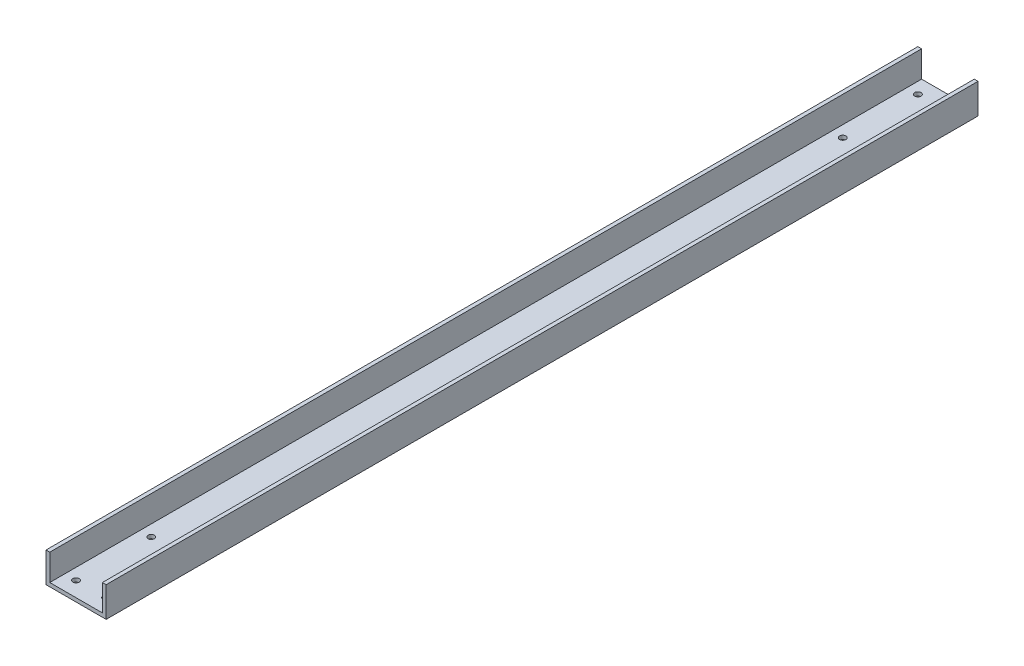
ISO-10303-21;
HEADER;
FILE_DESCRIPTION(('STEP AP214'),'2;1');
FILE_NAME('part.step','',(''),(''),'','','');
FILE_SCHEMA(('AUTOMOTIVE_DESIGN { 1 0 10303 214 1 1 1 1 }'));
ENDSEC;
DATA;
#1=APPLICATION_CONTEXT('core data for automotive mechanical design processes');
#2=APPLICATION_PROTOCOL_DEFINITION('international standard','automotive_design',2000,#1);
#3=PRODUCT_CONTEXT('',#1,'mechanical');
#4=PRODUCT('Part','Part','',(#3));
#5=PRODUCT_RELATED_PRODUCT_CATEGORY('part','',(#4));
#6=PRODUCT_DEFINITION_FORMATION('','',#4);
#7=PRODUCT_DEFINITION_CONTEXT('part definition',#1,'design');
#8=PRODUCT_DEFINITION('design','',#6,#7);
#9=PRODUCT_DEFINITION_SHAPE('','',#8);
#10=(LENGTH_UNIT() NAMED_UNIT(*) SI_UNIT(.MILLI.,.METRE.));
#11=(NAMED_UNIT(*) PLANE_ANGLE_UNIT() SI_UNIT($,.RADIAN.));
#12=(NAMED_UNIT(*) SI_UNIT($,.STERADIAN.) SOLID_ANGLE_UNIT());
#13=UNCERTAINTY_MEASURE_WITH_UNIT(LENGTH_MEASURE(1.E-05),#10,'distance_accuracy_value','');
#14=(GEOMETRIC_REPRESENTATION_CONTEXT(3) GLOBAL_UNCERTAINTY_ASSIGNED_CONTEXT((#13)) GLOBAL_UNIT_ASSIGNED_CONTEXT((#10,
#11,#12)) REPRESENTATION_CONTEXT('',''));
#15=CARTESIAN_POINT('',(0.,0.,0.));
#16=DIRECTION('',(0.,0.,1.));
#17=DIRECTION('',(1.,0.,0.));
#18=AXIS2_PLACEMENT_3D('',#15,#16,#17);
#19=CARTESIAN_POINT('',(0.,0.,736.6));
#20=DIRECTION('',(1.,0.,0.));
#21=DIRECTION('',(0.,0.,-1.));
#22=AXIS2_PLACEMENT_3D('',#19,#20,#21);
#23=PLANE('',#22);
#24=DIRECTION('',(0.,-1.,0.));
#25=VECTOR('',#24,1.);
#26=CARTESIAN_POINT('',(0.,0.,0.));
#27=LINE('',#26,#25);
#28=CARTESIAN_POINT('',(0.,25.4,0.));
#29=VERTEX_POINT('',#28);
#30=CARTESIAN_POINT('',(0.,0.,0.));
#31=VERTEX_POINT('',#30);
#32=EDGE_CURVE('E134',#29,#31,#27,.T.);
#33=ORIENTED_EDGE('',*,*,#32,.T.);
#34=DIRECTION('',(0.,0.,-1.));
#35=VECTOR('',#34,1.);
#36=CARTESIAN_POINT('',(0.,0.,736.6));
#37=LINE('',#36,#35);
#38=CARTESIAN_POINT('',(0.,0.,736.6));
#39=VERTEX_POINT('',#38);
#40=EDGE_CURVE('E11',#39,#31,#37,.T.);
#41=ORIENTED_EDGE('',*,*,#40,.F.);
#42=DIRECTION('',(0.,-1.,0.));
#43=VECTOR('',#42,1.);
#44=CARTESIAN_POINT('',(0.,0.,736.6));
#45=LINE('',#44,#43);
#46=CARTESIAN_POINT('',(0.,25.4,736.6));
#47=VERTEX_POINT('',#46);
#48=EDGE_CURVE('E149',#47,#39,#45,.T.);
#49=ORIENTED_EDGE('',*,*,#48,.F.);
#50=DIRECTION('',(0.,0.,-1.));
#51=VECTOR('',#50,1.);
#52=CARTESIAN_POINT('',(0.,25.4,736.6));
#53=LINE('',#52,#51);
#54=EDGE_CURVE('E130',#47,#29,#53,.T.);
#55=ORIENTED_EDGE('',*,*,#54,.T.);
#56=EDGE_LOOP('',(#33,#41,#49,#55));
#57=FACE_BOUND('',#56,.T.);
#58=ADVANCED_FACE('F36',(#57),#23,.F.);
#59=CARTESIAN_POINT('',(0.,0.,736.6));
#60=DIRECTION('',(0.,1.,0.));
#61=DIRECTION('',(0.,0.,1.));
#62=AXIS2_PLACEMENT_3D('',#59,#60,#61);
#63=PLANE('',#62);
#64=CARTESIAN_POINT('',(12.7,0.,660.4));
#65=DIRECTION('',(0.,1.,0.));
#66=DIRECTION('',(0.,0.,1.));
#67=AXIS2_PLACEMENT_3D('',#64,#65,#66);
#68=CIRCLE('',#67,2.667);
#69=CARTESIAN_POINT('',(12.7,0.,663.067));
#70=VERTEX_POINT('',#69);
#71=EDGE_CURVE('E193',#70,#70,#68,.F.);
#72=ORIENTED_EDGE('',*,*,#71,.F.);
#73=EDGE_LOOP('',(#72));
#74=FACE_BOUND('',#73,.T.);
#75=CARTESIAN_POINT('',(38.1,0.,660.4));
#76=DIRECTION('',(0.,1.,0.));
#77=DIRECTION('',(0.,0.,1.));
#78=AXIS2_PLACEMENT_3D('',#75,#76,#77);
#79=CIRCLE('',#78,2.667);
#80=CARTESIAN_POINT('',(38.1,0.,663.067));
#81=VERTEX_POINT('',#80);
#82=EDGE_CURVE('E225',#81,#81,#79,.F.);
#83=ORIENTED_EDGE('',*,*,#82,.F.);
#84=EDGE_LOOP('',(#83));
#85=FACE_BOUND('',#84,.T.);
#86=CARTESIAN_POINT('',(38.1,0.,723.9));
#87=DIRECTION('',(0.,1.,0.));
#88=DIRECTION('',(0.,0.,1.));
#89=AXIS2_PLACEMENT_3D('',#86,#87,#88);
#90=CIRCLE('',#89,2.667);
#91=CARTESIAN_POINT('',(38.1,0.,726.567));
#92=VERTEX_POINT('',#91);
#93=EDGE_CURVE('E219',#92,#92,#90,.F.);
#94=ORIENTED_EDGE('',*,*,#93,.F.);
#95=EDGE_LOOP('',(#94));
#96=FACE_BOUND('',#95,.T.);
#97=CARTESIAN_POINT('',(38.1,0.,12.7));
#98=DIRECTION('',(0.,1.,0.));
#99=DIRECTION('',(0.,0.,1.));
#100=AXIS2_PLACEMENT_3D('',#97,#98,#99);
#101=CIRCLE('',#100,2.667);
#102=CARTESIAN_POINT('',(38.1,0.,15.367));
#103=VERTEX_POINT('',#102);
#104=EDGE_CURVE('E213',#103,#103,#101,.F.);
#105=ORIENTED_EDGE('',*,*,#104,.F.);
#106=EDGE_LOOP('',(#105));
#107=FACE_BOUND('',#106,.T.);
#108=CARTESIAN_POINT('',(38.1,0.,76.2));
#109=DIRECTION('',(0.,1.,0.));
#110=DIRECTION('',(0.,0.,1.));
#111=AXIS2_PLACEMENT_3D('',#108,#109,#110);
#112=CIRCLE('',#111,2.667);
#113=CARTESIAN_POINT('',(38.1,0.,78.867));
#114=VERTEX_POINT('',#113);
#115=EDGE_CURVE('E207',#114,#114,#112,.F.);
#116=ORIENTED_EDGE('',*,*,#115,.F.);
#117=EDGE_LOOP('',(#116));
#118=FACE_BOUND('',#117,.T.);
#119=CARTESIAN_POINT('',(12.7,0.,12.7));
#120=DIRECTION('',(0.,1.,0.));
#121=DIRECTION('',(0.,0.,1.));
#122=AXIS2_PLACEMENT_3D('',#119,#120,#121);
#123=CIRCLE('',#122,2.667);
#124=CARTESIAN_POINT('',(12.7,0.,15.367));
#125=VERTEX_POINT('',#124);
#126=EDGE_CURVE('E201',#125,#125,#123,.F.);
#127=ORIENTED_EDGE('',*,*,#126,.F.);
#128=EDGE_LOOP('',(#127));
#129=FACE_BOUND('',#128,.T.);
#130=CARTESIAN_POINT('',(12.7,0.,76.2));
#131=DIRECTION('',(0.,1.,0.));
#132=DIRECTION('',(0.,0.,1.));
#133=AXIS2_PLACEMENT_3D('',#130,#131,#132);
#134=CIRCLE('',#133,2.667);
#135=CARTESIAN_POINT('',(12.7,0.,78.867));
#136=VERTEX_POINT('',#135);
#137=EDGE_CURVE('E194',#136,#136,#134,.F.);
#138=ORIENTED_EDGE('',*,*,#137,.F.);
#139=EDGE_LOOP('',(#138));
#140=FACE_BOUND('',#139,.T.);
#141=CARTESIAN_POINT('',(12.7,0.,723.9));
#142=DIRECTION('',(0.,1.,0.));
#143=DIRECTION('',(0.,0.,1.));
#144=AXIS2_PLACEMENT_3D('',#141,#142,#143);
#145=CIRCLE('',#144,2.667);
#146=CARTESIAN_POINT('',(12.7,0.,726.567));
#147=VERTEX_POINT('',#146);
#148=EDGE_CURVE('E138',#147,#147,#145,.F.);
#149=ORIENTED_EDGE('',*,*,#148,.F.);
#150=EDGE_LOOP('',(#149));
#151=FACE_BOUND('',#150,.T.);
#152=DIRECTION('',(1.,0.,0.));
#153=VECTOR('',#152,1.);
#154=CARTESIAN_POINT('',(0.,0.,0.));
#155=LINE('',#154,#153);
#156=CARTESIAN_POINT('',(50.8,0.,0.));
#157=VERTEX_POINT('',#156);
#158=EDGE_CURVE('E137',#31,#157,#155,.T.);
#159=ORIENTED_EDGE('',*,*,#158,.T.);
#160=DIRECTION('',(0.,0.,-1.));
#161=VECTOR('',#160,1.);
#162=CARTESIAN_POINT('',(50.8,0.,736.6));
#163=LINE('',#162,#161);
#164=CARTESIAN_POINT('',(50.8,0.,736.6));
#165=VERTEX_POINT('',#164);
#166=EDGE_CURVE('E45',#165,#157,#163,.T.);
#167=ORIENTED_EDGE('',*,*,#166,.F.);
#168=DIRECTION('',(1.,0.,0.));
#169=VECTOR('',#168,1.);
#170=CARTESIAN_POINT('',(0.,0.,736.6));
#171=LINE('',#170,#169);
#172=EDGE_CURVE('E96',#39,#165,#171,.T.);
#173=ORIENTED_EDGE('',*,*,#172,.F.);
#174=ORIENTED_EDGE('',*,*,#40,.T.);
#175=EDGE_LOOP('',(#159,#167,#173,#174));
#176=FACE_BOUND('',#175,.T.);
#177=ADVANCED_FACE('F263',(#74,#85,#96,#107,#118,#129,#140,#151,#176),#63,.F.);
#178=CARTESIAN_POINT('',(50.8,0.,736.6));
#179=DIRECTION('',(-1.,0.,0.));
#180=DIRECTION('',(0.,0.,1.));
#181=AXIS2_PLACEMENT_3D('',#178,#179,#180);
#182=PLANE('',#181);
#183=DIRECTION('',(0.,1.,0.));
#184=VECTOR('',#183,1.);
#185=CARTESIAN_POINT('',(50.8,0.,0.));
#186=LINE('',#185,#184);
#187=CARTESIAN_POINT('',(50.8,25.4,0.));
#188=VERTEX_POINT('',#187);
#189=EDGE_CURVE('E140',#157,#188,#186,.T.);
#190=ORIENTED_EDGE('',*,*,#189,.T.);
#191=DIRECTION('',(0.,0.,-1.));
#192=VECTOR('',#191,1.);
#193=CARTESIAN_POINT('',(50.8,25.4,736.6));
#194=LINE('',#193,#192);
#195=CARTESIAN_POINT('',(50.8,25.4,736.6));
#196=VERTEX_POINT('',#195);
#197=EDGE_CURVE('E160',#196,#188,#194,.T.);
#198=ORIENTED_EDGE('',*,*,#197,.F.);
#199=DIRECTION('',(0.,1.,0.));
#200=VECTOR('',#199,1.);
#201=CARTESIAN_POINT('',(50.8,0.,736.6));
#202=LINE('',#201,#200);
#203=EDGE_CURVE('E170',#165,#196,#202,.T.);
#204=ORIENTED_EDGE('',*,*,#203,.F.);
#205=ORIENTED_EDGE('',*,*,#166,.T.);
#206=EDGE_LOOP('',(#190,#198,#204,#205));
#207=FACE_BOUND('',#206,.T.);
#208=ADVANCED_FACE('F168',(#207),#182,.F.);
#209=CARTESIAN_POINT('',(47.625,25.4,736.6));
#210=DIRECTION('',(0.,-1.,0.));
#211=DIRECTION('',(0.,0.,-1.));
#212=AXIS2_PLACEMENT_3D('',#209,#210,#211);
#213=PLANE('',#212);
#214=DIRECTION('',(-1.,0.,0.));
#215=VECTOR('',#214,1.);
#216=CARTESIAN_POINT('',(47.625,25.4,0.));
#217=LINE('',#216,#215);
#218=CARTESIAN_POINT('',(47.625,25.4,0.));
#219=VERTEX_POINT('',#218);
#220=EDGE_CURVE('E142',#188,#219,#217,.T.);
#221=ORIENTED_EDGE('',*,*,#220,.T.);
#222=DIRECTION('',(0.,0.,-1.));
#223=VECTOR('',#222,1.);
#224=CARTESIAN_POINT('',(47.625,25.4,736.6));
#225=LINE('',#224,#223);
#226=CARTESIAN_POINT('',(47.625,25.4,736.6));
#227=VERTEX_POINT('',#226);
#228=EDGE_CURVE('E156',#227,#219,#225,.T.);
#229=ORIENTED_EDGE('',*,*,#228,.F.);
#230=DIRECTION('',(-1.,0.,0.));
#231=VECTOR('',#230,1.);
#232=CARTESIAN_POINT('',(47.625,25.4,736.6));
#233=LINE('',#232,#231);
#234=EDGE_CURVE('E182',#196,#227,#233,.T.);
#235=ORIENTED_EDGE('',*,*,#234,.F.);
#236=ORIENTED_EDGE('',*,*,#197,.T.);
#237=EDGE_LOOP('',(#221,#229,#235,#236));
#238=FACE_BOUND('',#237,.T.);
#239=ADVANCED_FACE('F178',(#238),#213,.F.);
#240=CARTESIAN_POINT('',(47.625,3.175,736.6));
#241=DIRECTION('',(1.,0.,0.));
#242=DIRECTION('',(0.,0.,-1.));
#243=AXIS2_PLACEMENT_3D('',#240,#241,#242);
#244=PLANE('',#243);
#245=DIRECTION('',(0.,-1.,0.));
#246=VECTOR('',#245,1.);
#247=CARTESIAN_POINT('',(47.625,3.175,0.));
#248=LINE('',#247,#246);
#249=CARTESIAN_POINT('',(47.625,3.175,0.));
#250=VERTEX_POINT('',#249);
#251=EDGE_CURVE('E144',#219,#250,#248,.T.);
#252=ORIENTED_EDGE('',*,*,#251,.T.);
#253=DIRECTION('',(0.,0.,-1.));
#254=VECTOR('',#253,1.);
#255=CARTESIAN_POINT('',(47.625,3.175,736.6));
#256=LINE('',#255,#254);
#257=CARTESIAN_POINT('',(47.625,3.175,736.6));
#258=VERTEX_POINT('',#257);
#259=EDGE_CURVE('E125',#258,#250,#256,.T.);
#260=ORIENTED_EDGE('',*,*,#259,.F.);
#261=DIRECTION('',(0.,-1.,0.));
#262=VECTOR('',#261,1.);
#263=CARTESIAN_POINT('',(47.625,3.175,736.6));
#264=LINE('',#263,#262);
#265=EDGE_CURVE('E115',#227,#258,#264,.T.);
#266=ORIENTED_EDGE('',*,*,#265,.F.);
#267=ORIENTED_EDGE('',*,*,#228,.T.);
#268=EDGE_LOOP('',(#252,#260,#266,#267));
#269=FACE_BOUND('',#268,.T.);
#270=ADVANCED_FACE('F181',(#269),#244,.F.);
#271=CARTESIAN_POINT('',(3.175,3.175,736.6));
#272=DIRECTION('',(0.,-1.,0.));
#273=DIRECTION('',(0.,0.,-1.));
#274=AXIS2_PLACEMENT_3D('',#271,#272,#273);
#275=PLANE('',#274);
#276=CARTESIAN_POINT('',(12.7,3.175,660.4));
#277=DIRECTION('',(0.,1.,0.));
#278=DIRECTION('',(0.,0.,1.));
#279=AXIS2_PLACEMENT_3D('',#276,#277,#278);
#280=CIRCLE('',#279,2.667);
#281=CARTESIAN_POINT('',(12.7,3.175,663.067));
#282=VERTEX_POINT('',#281);
#283=EDGE_CURVE('E228',#282,#282,#280,.T.);
#284=ORIENTED_EDGE('',*,*,#283,.F.);
#285=EDGE_LOOP('',(#284));
#286=FACE_BOUND('',#285,.T.);
#287=CARTESIAN_POINT('',(38.1,3.175,660.4));
#288=DIRECTION('',(0.,1.,0.));
#289=DIRECTION('',(0.,0.,1.));
#290=AXIS2_PLACEMENT_3D('',#287,#288,#289);
#291=CIRCLE('',#290,2.667);
#292=CARTESIAN_POINT('',(38.1,3.175,663.067));
#293=VERTEX_POINT('',#292);
#294=EDGE_CURVE('E222',#293,#293,#291,.T.);
#295=ORIENTED_EDGE('',*,*,#294,.F.);
#296=EDGE_LOOP('',(#295));
#297=FACE_BOUND('',#296,.T.);
#298=CARTESIAN_POINT('',(38.1,3.175,723.9));
#299=DIRECTION('',(0.,1.,0.));
#300=DIRECTION('',(0.,0.,1.));
#301=AXIS2_PLACEMENT_3D('',#298,#299,#300);
#302=CIRCLE('',#301,2.667);
#303=CARTESIAN_POINT('',(38.1,3.175,726.567));
#304=VERTEX_POINT('',#303);
#305=EDGE_CURVE('E216',#304,#304,#302,.T.);
#306=ORIENTED_EDGE('',*,*,#305,.F.);
#307=EDGE_LOOP('',(#306));
#308=FACE_BOUND('',#307,.T.);
#309=CARTESIAN_POINT('',(38.1,3.175,12.7));
#310=DIRECTION('',(0.,1.,0.));
#311=DIRECTION('',(0.,0.,-1.));
#312=AXIS2_PLACEMENT_3D('',#309,#310,#311);
#313=CIRCLE('',#312,2.667);
#314=CARTESIAN_POINT('',(38.1,3.175,10.033));
#315=VERTEX_POINT('',#314);
#316=EDGE_CURVE('E210',#315,#315,#313,.T.);
#317=ORIENTED_EDGE('',*,*,#316,.F.);
#318=EDGE_LOOP('',(#317));
#319=FACE_BOUND('',#318,.T.);
#320=CARTESIAN_POINT('',(38.1,3.175,76.2));
#321=DIRECTION('',(0.,1.,0.));
#322=DIRECTION('',(0.,0.,-1.));
#323=AXIS2_PLACEMENT_3D('',#320,#321,#322);
#324=CIRCLE('',#323,2.667);
#325=CARTESIAN_POINT('',(38.1,3.175,73.533));
#326=VERTEX_POINT('',#325);
#327=EDGE_CURVE('E204',#326,#326,#324,.T.);
#328=ORIENTED_EDGE('',*,*,#327,.F.);
#329=EDGE_LOOP('',(#328));
#330=FACE_BOUND('',#329,.T.);
#331=CARTESIAN_POINT('',(12.7,3.175,12.7));
#332=DIRECTION('',(0.,1.,0.));
#333=DIRECTION('',(0.,0.,-1.));
#334=AXIS2_PLACEMENT_3D('',#331,#332,#333);
#335=CIRCLE('',#334,2.667);
#336=CARTESIAN_POINT('',(12.7,3.175,10.033));
#337=VERTEX_POINT('',#336);
#338=EDGE_CURVE('E197',#337,#337,#335,.T.);
#339=ORIENTED_EDGE('',*,*,#338,.F.);
#340=EDGE_LOOP('',(#339));
#341=FACE_BOUND('',#340,.T.);
#342=CARTESIAN_POINT('',(12.7,3.175,76.2));
#343=DIRECTION('',(0.,1.,0.));
#344=DIRECTION('',(0.,0.,-1.));
#345=AXIS2_PLACEMENT_3D('',#342,#343,#344);
#346=CIRCLE('',#345,2.667);
#347=CARTESIAN_POINT('',(12.7,3.175,73.533));
#348=VERTEX_POINT('',#347);
#349=EDGE_CURVE('E198',#348,#348,#346,.T.);
#350=ORIENTED_EDGE('',*,*,#349,.F.);
#351=EDGE_LOOP('',(#350));
#352=FACE_BOUND('',#351,.T.);
#353=CARTESIAN_POINT('',(12.7,3.175,723.9));
#354=DIRECTION('',(0.,1.,0.));
#355=DIRECTION('',(0.,0.,1.));
#356=AXIS2_PLACEMENT_3D('',#353,#354,#355);
#357=CIRCLE('',#356,2.667);
#358=CARTESIAN_POINT('',(12.7,3.175,726.567));
#359=VERTEX_POINT('',#358);
#360=EDGE_CURVE('E190',#359,#359,#357,.T.);
#361=ORIENTED_EDGE('',*,*,#360,.F.);
#362=EDGE_LOOP('',(#361));
#363=FACE_BOUND('',#362,.T.);
#364=DIRECTION('',(-1.,0.,0.));
#365=VECTOR('',#364,1.);
#366=CARTESIAN_POINT('',(3.175,3.175,0.));
#367=LINE('',#366,#365);
#368=CARTESIAN_POINT('',(3.175,3.175,0.));
#369=VERTEX_POINT('',#368);
#370=EDGE_CURVE('E123',#250,#369,#367,.T.);
#371=ORIENTED_EDGE('',*,*,#370,.T.);
#372=DIRECTION('',(0.,0.,-1.));
#373=VECTOR('',#372,1.);
#374=CARTESIAN_POINT('',(3.175,3.175,736.6));
#375=LINE('',#374,#373);
#376=CARTESIAN_POINT('',(3.175,3.175,736.6));
#377=VERTEX_POINT('',#376);
#378=EDGE_CURVE('E120',#377,#369,#375,.T.);
#379=ORIENTED_EDGE('',*,*,#378,.F.);
#380=DIRECTION('',(-1.,0.,0.));
#381=VECTOR('',#380,1.);
#382=CARTESIAN_POINT('',(3.175,3.175,736.6));
#383=LINE('',#382,#381);
#384=EDGE_CURVE('E109',#258,#377,#383,.T.);
#385=ORIENTED_EDGE('',*,*,#384,.F.);
#386=ORIENTED_EDGE('',*,*,#259,.T.);
#387=EDGE_LOOP('',(#371,#379,#385,#386));
#388=FACE_BOUND('',#387,.T.);
#389=ADVANCED_FACE('F121',(#286,#297,#308,#319,#330,#341,#352,#363,#388),#275,.F.);
#390=CARTESIAN_POINT('',(3.175,3.175,736.6));
#391=DIRECTION('',(-1.,0.,0.));
#392=DIRECTION('',(0.,0.,1.));
#393=AXIS2_PLACEMENT_3D('',#390,#391,#392);
#394=PLANE('',#393);
#395=DIRECTION('',(0.,1.,0.));
#396=VECTOR('',#395,1.);
#397=CARTESIAN_POINT('',(3.175,3.175,0.));
#398=LINE('',#397,#396);
#399=CARTESIAN_POINT('',(3.175,25.4,0.));
#400=VERTEX_POINT('',#399);
#401=EDGE_CURVE('E82',#369,#400,#398,.T.);
#402=ORIENTED_EDGE('',*,*,#401,.T.);
#403=DIRECTION('',(0.,0.,-1.));
#404=VECTOR('',#403,1.);
#405=CARTESIAN_POINT('',(3.175,25.4,736.6));
#406=LINE('',#405,#404);
#407=CARTESIAN_POINT('',(3.175,25.4,736.6));
#408=VERTEX_POINT('',#407);
#409=EDGE_CURVE('E126',#408,#400,#406,.T.);
#410=ORIENTED_EDGE('',*,*,#409,.F.);
#411=DIRECTION('',(0.,1.,0.));
#412=VECTOR('',#411,1.);
#413=CARTESIAN_POINT('',(3.175,3.175,736.6));
#414=LINE('',#413,#412);
#415=EDGE_CURVE('E113',#377,#408,#414,.T.);
#416=ORIENTED_EDGE('',*,*,#415,.F.);
#417=ORIENTED_EDGE('',*,*,#378,.T.);
#418=EDGE_LOOP('',(#402,#410,#416,#417));
#419=FACE_BOUND('',#418,.T.);
#420=ADVANCED_FACE('F128',(#419),#394,.F.);
#421=CARTESIAN_POINT('',(0.,25.4,736.6));
#422=DIRECTION('',(0.,-1.,0.));
#423=DIRECTION('',(0.,0.,-1.));
#424=AXIS2_PLACEMENT_3D('',#421,#422,#423);
#425=PLANE('',#424);
#426=DIRECTION('',(-1.,0.,0.));
#427=VECTOR('',#426,1.);
#428=CARTESIAN_POINT('',(0.,25.4,0.));
#429=LINE('',#428,#427);
#430=EDGE_CURVE('E88',#400,#29,#429,.T.);
#431=ORIENTED_EDGE('',*,*,#430,.T.);
#432=ORIENTED_EDGE('',*,*,#54,.F.);
#433=DIRECTION('',(-1.,0.,0.));
#434=VECTOR('',#433,1.);
#435=CARTESIAN_POINT('',(0.,25.4,736.6));
#436=LINE('',#435,#434);
#437=EDGE_CURVE('E53',#408,#47,#436,.T.);
#438=ORIENTED_EDGE('',*,*,#437,.F.);
#439=ORIENTED_EDGE('',*,*,#409,.T.);
#440=EDGE_LOOP('',(#431,#432,#438,#439));
#441=FACE_BOUND('',#440,.T.);
#442=ADVANCED_FACE('F269',(#441),#425,.F.);
#443=CARTESIAN_POINT('',(0.,0.,736.6));
#444=DIRECTION('',(0.,0.,-1.));
#445=DIRECTION('',(-1.,0.,0.));
#446=AXIS2_PLACEMENT_3D('',#443,#444,#445);
#447=PLANE('',#446);
#448=ORIENTED_EDGE('',*,*,#48,.T.);
#449=ORIENTED_EDGE('',*,*,#172,.T.);
#450=ORIENTED_EDGE('',*,*,#203,.T.);
#451=ORIENTED_EDGE('',*,*,#234,.T.);
#452=ORIENTED_EDGE('',*,*,#265,.T.);
#453=ORIENTED_EDGE('',*,*,#384,.T.);
#454=ORIENTED_EDGE('',*,*,#415,.T.);
#455=ORIENTED_EDGE('',*,*,#437,.T.);
#456=EDGE_LOOP('',(#448,#449,#450,#451,#452,#453,#454,#455));
#457=FACE_BOUND('',#456,.T.);
#458=ADVANCED_FACE('F111',(#457),#447,.F.);
#459=CARTESIAN_POINT('',(0.,0.,0.));
#460=DIRECTION('',(0.,0.,-1.));
#461=DIRECTION('',(-1.,0.,0.));
#462=AXIS2_PLACEMENT_3D('',#459,#460,#461);
#463=PLANE('',#462);
#464=ORIENTED_EDGE('',*,*,#32,.F.);
#465=ORIENTED_EDGE('',*,*,#430,.F.);
#466=ORIENTED_EDGE('',*,*,#401,.F.);
#467=ORIENTED_EDGE('',*,*,#370,.F.);
#468=ORIENTED_EDGE('',*,*,#251,.F.);
#469=ORIENTED_EDGE('',*,*,#220,.F.);
#470=ORIENTED_EDGE('',*,*,#189,.F.);
#471=ORIENTED_EDGE('',*,*,#158,.F.);
#472=EDGE_LOOP('',(#464,#465,#466,#467,#468,#469,#470,#471));
#473=FACE_BOUND('',#472,.T.);
#474=ADVANCED_FACE('F174',(#473),#463,.T.);
#475=CARTESIAN_POINT('',(12.7,-0.00100000000000013,723.9));
#476=DIRECTION('',(0.,1.,0.));
#477=DIRECTION('',(0.,0.,1.));
#478=AXIS2_PLACEMENT_3D('',#475,#476,#477);
#479=CYLINDRICAL_SURFACE('',#478,2.667);
#480=ORIENTED_EDGE('',*,*,#360,.T.);
#481=EDGE_LOOP('',(#480));
#482=FACE_BOUND('',#481,.T.);
#483=ORIENTED_EDGE('',*,*,#148,.T.);
#484=EDGE_LOOP('',(#483));
#485=FACE_BOUND('',#484,.T.);
#486=ADVANCED_FACE('F256',(#482,#485),#479,.F.);
#487=CARTESIAN_POINT('',(12.7,-0.00100000000000013,76.2));
#488=DIRECTION('',(0.,1.,0.));
#489=DIRECTION('',(0.,0.,1.));
#490=AXIS2_PLACEMENT_3D('',#487,#488,#489);
#491=CYLINDRICAL_SURFACE('',#490,2.667);
#492=ORIENTED_EDGE('',*,*,#349,.T.);
#493=EDGE_LOOP('',(#492));
#494=FACE_BOUND('',#493,.T.);
#495=ORIENTED_EDGE('',*,*,#137,.T.);
#496=EDGE_LOOP('',(#495));
#497=FACE_BOUND('',#496,.T.);
#498=ADVANCED_FACE('F259',(#494,#497),#491,.F.);
#499=CARTESIAN_POINT('',(12.7,-0.00100000000000013,12.7));
#500=DIRECTION('',(0.,1.,0.));
#501=DIRECTION('',(0.,0.,1.));
#502=AXIS2_PLACEMENT_3D('',#499,#500,#501);
#503=CYLINDRICAL_SURFACE('',#502,2.667);
#504=ORIENTED_EDGE('',*,*,#338,.T.);
#505=EDGE_LOOP('',(#504));
#506=FACE_BOUND('',#505,.T.);
#507=ORIENTED_EDGE('',*,*,#126,.T.);
#508=EDGE_LOOP('',(#507));
#509=FACE_BOUND('',#508,.T.);
#510=ADVANCED_FACE('F350',(#506,#509),#503,.F.);
#511=CARTESIAN_POINT('',(38.1,-0.00100000000000013,76.2));
#512=DIRECTION('',(0.,1.,0.));
#513=DIRECTION('',(0.,0.,1.));
#514=AXIS2_PLACEMENT_3D('',#511,#512,#513);
#515=CYLINDRICAL_SURFACE('',#514,2.667);
#516=ORIENTED_EDGE('',*,*,#327,.T.);
#517=EDGE_LOOP('',(#516));
#518=FACE_BOUND('',#517,.T.);
#519=ORIENTED_EDGE('',*,*,#115,.T.);
#520=EDGE_LOOP('',(#519));
#521=FACE_BOUND('',#520,.T.);
#522=ADVANCED_FACE('F360',(#518,#521),#515,.F.);
#523=CARTESIAN_POINT('',(38.1,-0.00100000000000013,12.7));
#524=DIRECTION('',(0.,1.,0.));
#525=DIRECTION('',(0.,0.,1.));
#526=AXIS2_PLACEMENT_3D('',#523,#524,#525);
#527=CYLINDRICAL_SURFACE('',#526,2.667);
#528=ORIENTED_EDGE('',*,*,#316,.T.);
#529=EDGE_LOOP('',(#528));
#530=FACE_BOUND('',#529,.T.);
#531=ORIENTED_EDGE('',*,*,#104,.T.);
#532=EDGE_LOOP('',(#531));
#533=FACE_BOUND('',#532,.T.);
#534=ADVANCED_FACE('F370',(#530,#533),#527,.F.);
#535=CARTESIAN_POINT('',(38.1,-0.00100000000000013,723.9));
#536=DIRECTION('',(0.,1.,0.));
#537=DIRECTION('',(0.,0.,1.));
#538=AXIS2_PLACEMENT_3D('',#535,#536,#537);
#539=CYLINDRICAL_SURFACE('',#538,2.667);
#540=ORIENTED_EDGE('',*,*,#305,.T.);
#541=EDGE_LOOP('',(#540));
#542=FACE_BOUND('',#541,.T.);
#543=ORIENTED_EDGE('',*,*,#93,.T.);
#544=EDGE_LOOP('',(#543));
#545=FACE_BOUND('',#544,.T.);
#546=ADVANCED_FACE('F380',(#542,#545),#539,.F.);
#547=CARTESIAN_POINT('',(38.1,-0.00100000000000013,660.4));
#548=DIRECTION('',(0.,1.,0.));
#549=DIRECTION('',(0.,0.,1.));
#550=AXIS2_PLACEMENT_3D('',#547,#548,#549);
#551=CYLINDRICAL_SURFACE('',#550,2.667);
#552=ORIENTED_EDGE('',*,*,#294,.T.);
#553=EDGE_LOOP('',(#552));
#554=FACE_BOUND('',#553,.T.);
#555=ORIENTED_EDGE('',*,*,#82,.T.);
#556=EDGE_LOOP('',(#555));
#557=FACE_BOUND('',#556,.T.);
#558=ADVANCED_FACE('F390',(#554,#557),#551,.F.);
#559=CARTESIAN_POINT('',(12.7,-0.00100000000000013,660.4));
#560=DIRECTION('',(0.,1.,0.));
#561=DIRECTION('',(0.,0.,1.));
#562=AXIS2_PLACEMENT_3D('',#559,#560,#561);
#563=CYLINDRICAL_SURFACE('',#562,2.667);
#564=ORIENTED_EDGE('',*,*,#283,.T.);
#565=EDGE_LOOP('',(#564));
#566=FACE_BOUND('',#565,.T.);
#567=ORIENTED_EDGE('',*,*,#71,.T.);
#568=EDGE_LOOP('',(#567));
#569=FACE_BOUND('',#568,.T.);
#570=ADVANCED_FACE('F236',(#566,#569),#563,.F.);
#571=CLOSED_SHELL('',(#58,#177,#208,#239,#270,#389,#420,#442,#458,#474,#486,#498,#510,#522,#534,
#546,#558,#570));
#572=MANIFOLD_SOLID_BREP('B2',#571);
#573=ADVANCED_BREP_SHAPE_REPRESENTATION('',(#18,#572),#14);
#574=SHAPE_DEFINITION_REPRESENTATION(#9,#573);
ENDSEC;
END-ISO-10303-21;
